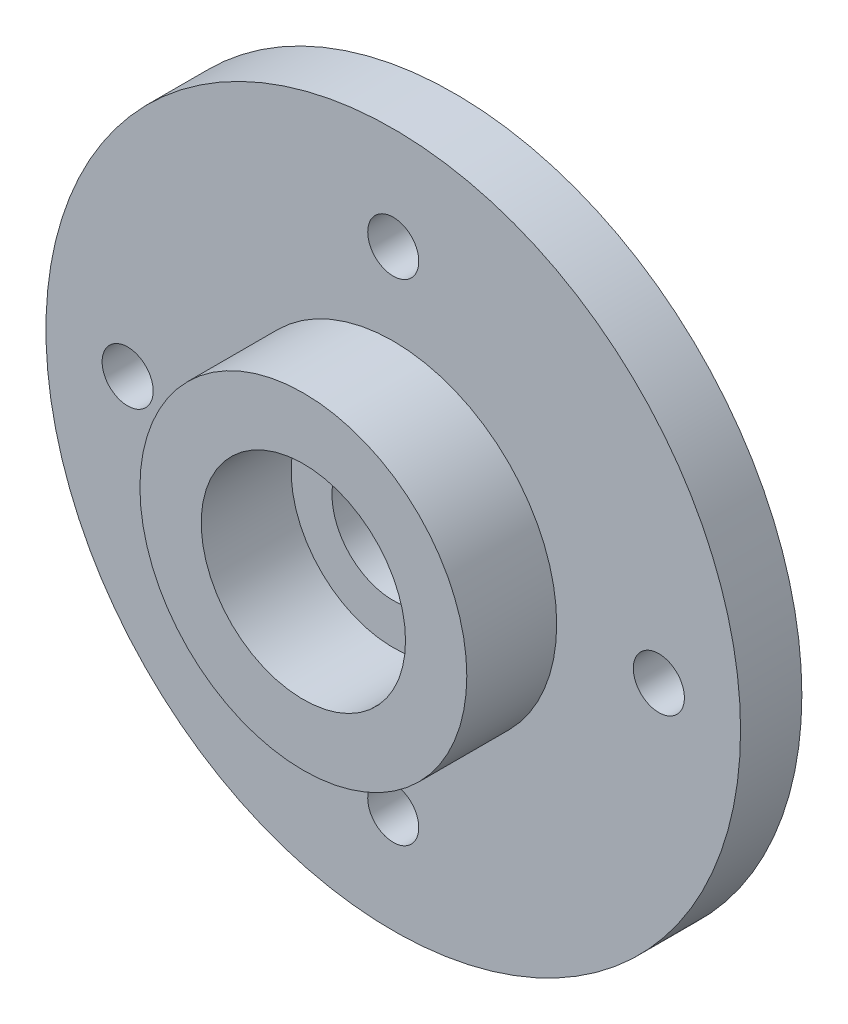
ISO-10303-21;
HEADER;
FILE_DESCRIPTION(('STEP AP214'),'2;1');
FILE_NAME('part.step','',(''),(''),'','','');
FILE_SCHEMA(('AUTOMOTIVE_DESIGN { 1 0 10303 214 1 1 1 1 }'));
ENDSEC;
DATA;
#1=APPLICATION_CONTEXT('core data for automotive mechanical design processes');
#2=APPLICATION_PROTOCOL_DEFINITION('international standard','automotive_design',2000,#1);
#3=PRODUCT_CONTEXT('',#1,'mechanical');
#4=PRODUCT('Part','Part','',(#3));
#5=PRODUCT_RELATED_PRODUCT_CATEGORY('part','',(#4));
#6=PRODUCT_DEFINITION_FORMATION('','',#4);
#7=PRODUCT_DEFINITION_CONTEXT('part definition',#1,'design');
#8=PRODUCT_DEFINITION('design','',#6,#7);
#9=PRODUCT_DEFINITION_SHAPE('','',#8);
#10=(LENGTH_UNIT() NAMED_UNIT(*) SI_UNIT(.MILLI.,.METRE.));
#11=(NAMED_UNIT(*) PLANE_ANGLE_UNIT() SI_UNIT($,.RADIAN.));
#12=(NAMED_UNIT(*) SI_UNIT($,.STERADIAN.) SOLID_ANGLE_UNIT());
#13=UNCERTAINTY_MEASURE_WITH_UNIT(LENGTH_MEASURE(1.E-05),#10,'distance_accuracy_value','');
#14=(GEOMETRIC_REPRESENTATION_CONTEXT(3) GLOBAL_UNCERTAINTY_ASSIGNED_CONTEXT((#13)) GLOBAL_UNIT_ASSIGNED_CONTEXT((#10,
#11,#12)) REPRESENTATION_CONTEXT('',''));
#15=CARTESIAN_POINT('',(0.,0.,0.));
#16=DIRECTION('',(0.,0.,1.));
#17=DIRECTION('',(1.,0.,0.));
#18=AXIS2_PLACEMENT_3D('',#15,#16,#17);
#19=CARTESIAN_POINT('',(0.,0.,0.));
#20=DIRECTION('',(0.,0.,1.));
#21=DIRECTION('',(1.,0.,0.));
#22=AXIS2_PLACEMENT_3D('',#19,#20,#21);
#23=PLANE('',#22);
#24=CARTESIAN_POINT('',(0.,0.,0.));
#25=DIRECTION('',(0.,0.,1.));
#26=DIRECTION('',(1.,0.,0.));
#27=AXIS2_PLACEMENT_3D('',#24,#25,#26);
#28=CIRCLE('',#27,1.5);
#29=CARTESIAN_POINT('',(1.5,0.,0.));
#30=VERTEX_POINT('',#29);
#31=EDGE_CURVE('E61',#30,#30,#28,.T.);
#32=ORIENTED_EDGE('',*,*,#31,.T.);
#33=EDGE_LOOP('',(#32));
#34=FACE_BOUND('',#33,.T.);
#35=CARTESIAN_POINT('',(0.,0.,0.));
#36=DIRECTION('',(0.,0.,-1.));
#37=DIRECTION('',(-1.,0.,0.));
#38=AXIS2_PLACEMENT_3D('',#35,#36,#37);
#39=CIRCLE('',#38,3.);
#40=CARTESIAN_POINT('',(-3.,0.,0.));
#41=VERTEX_POINT('',#40);
#42=EDGE_CURVE('E98',#41,#41,#39,.T.);
#43=ORIENTED_EDGE('',*,*,#42,.T.);
#44=EDGE_LOOP('',(#43));
#45=FACE_BOUND('',#44,.T.);
#46=ADVANCED_FACE('F32',(#34,#45),#23,.F.);
#47=CARTESIAN_POINT('',(0.,0.,1.5));
#48=DIRECTION('',(0.,0.,-1.));
#49=DIRECTION('',(-1.,0.,0.));
#50=AXIS2_PLACEMENT_3D('',#47,#48,#49);
#51=CYLINDRICAL_SURFACE('',#50,8.5);
#52=CARTESIAN_POINT('',(0.,0.,1.5));
#53=DIRECTION('',(0.,0.,1.));
#54=DIRECTION('',(1.,0.,0.));
#55=AXIS2_PLACEMENT_3D('',#52,#53,#54);
#56=CIRCLE('',#55,8.5);
#57=CARTESIAN_POINT('',(8.5,0.,1.5));
#58=VERTEX_POINT('',#57);
#59=EDGE_CURVE('E43',#58,#58,#56,.T.);
#60=ORIENTED_EDGE('',*,*,#59,.F.);
#61=EDGE_LOOP('',(#60));
#62=FACE_BOUND('',#61,.T.);
#63=CARTESIAN_POINT('',(0.,0.,0.));
#64=DIRECTION('',(0.,0.,1.));
#65=DIRECTION('',(1.,0.,0.));
#66=AXIS2_PLACEMENT_3D('',#63,#64,#65);
#67=CIRCLE('',#66,8.5);
#68=CARTESIAN_POINT('',(8.5,0.,0.));
#69=VERTEX_POINT('',#68);
#70=EDGE_CURVE('E48',#69,#69,#67,.T.);
#71=ORIENTED_EDGE('',*,*,#70,.T.);
#72=EDGE_LOOP('',(#71));
#73=FACE_BOUND('',#72,.T.);
#74=ADVANCED_FACE('F34',(#62,#73),#51,.T.);
#75=CARTESIAN_POINT('',(0.,0.,1.5));
#76=DIRECTION('',(0.,0.,1.));
#77=DIRECTION('',(1.,0.,0.));
#78=AXIS2_PLACEMENT_3D('',#75,#76,#77);
#79=PLANE('',#78);
#80=CARTESIAN_POINT('',(0.,-6.,1.5));
#81=DIRECTION('',(0.,0.,-1.));
#82=DIRECTION('',(-1.,0.,0.));
#83=AXIS2_PLACEMENT_3D('',#80,#81,#82);
#84=CIRCLE('',#83,0.625);
#85=CARTESIAN_POINT('',(-0.625,-6.,1.5));
#86=VERTEX_POINT('',#85);
#87=EDGE_CURVE('E86',#86,#86,#84,.T.);
#88=ORIENTED_EDGE('',*,*,#87,.T.);
#89=EDGE_LOOP('',(#88));
#90=FACE_BOUND('',#89,.T.);
#91=CARTESIAN_POINT('',(0.,6.,1.5));
#92=DIRECTION('',(0.,0.,-1.));
#93=DIRECTION('',(-1.,0.,0.));
#94=AXIS2_PLACEMENT_3D('',#91,#92,#93);
#95=CIRCLE('',#94,0.625);
#96=CARTESIAN_POINT('',(-0.625,6.,1.5));
#97=VERTEX_POINT('',#96);
#98=EDGE_CURVE('E82',#97,#97,#95,.T.);
#99=ORIENTED_EDGE('',*,*,#98,.T.);
#100=EDGE_LOOP('',(#99));
#101=FACE_BOUND('',#100,.T.);
#102=CARTESIAN_POINT('',(-6.5,0.,1.5));
#103=DIRECTION('',(0.,0.,1.));
#104=DIRECTION('',(1.,0.,0.));
#105=AXIS2_PLACEMENT_3D('',#102,#103,#104);
#106=CIRCLE('',#105,0.625);
#107=CARTESIAN_POINT('',(-5.875,0.,1.5));
#108=VERTEX_POINT('',#107);
#109=EDGE_CURVE('E76',#108,#108,#106,.F.);
#110=ORIENTED_EDGE('',*,*,#109,.T.);
#111=EDGE_LOOP('',(#110));
#112=FACE_BOUND('',#111,.T.);
#113=CARTESIAN_POINT('',(6.5,0.,1.5));
#114=DIRECTION('',(0.,0.,1.));
#115=DIRECTION('',(1.,0.,0.));
#116=AXIS2_PLACEMENT_3D('',#113,#114,#115);
#117=CIRCLE('',#116,0.625);
#118=CARTESIAN_POINT('',(7.125,0.,1.5));
#119=VERTEX_POINT('',#118);
#120=EDGE_CURVE('E66',#119,#119,#117,.F.);
#121=ORIENTED_EDGE('',*,*,#120,.T.);
#122=EDGE_LOOP('',(#121));
#123=FACE_BOUND('',#122,.T.);
#124=CARTESIAN_POINT('',(0.,0.,1.5));
#125=DIRECTION('',(0.,0.,1.));
#126=DIRECTION('',(1.,0.,0.));
#127=AXIS2_PLACEMENT_3D('',#124,#125,#126);
#128=CIRCLE('',#127,4.);
#129=CARTESIAN_POINT('',(4.,0.,1.5));
#130=VERTEX_POINT('',#129);
#131=EDGE_CURVE('E54',#130,#130,#128,.F.);
#132=ORIENTED_EDGE('',*,*,#131,.T.);
#133=EDGE_LOOP('',(#132));
#134=FACE_BOUND('',#133,.T.);
#135=ORIENTED_EDGE('',*,*,#59,.T.);
#136=EDGE_LOOP('',(#135));
#137=FACE_BOUND('',#136,.T.);
#138=ADVANCED_FACE('F128',(#90,#101,#112,#123,#134,#137),#79,.T.);
#139=CARTESIAN_POINT('',(0.,0.,0.));
#140=DIRECTION('',(0.,0.,1.));
#141=DIRECTION('',(1.,0.,0.));
#142=AXIS2_PLACEMENT_3D('',#139,#140,#141);
#143=CIRCLE('',#142,3.5);
#144=CARTESIAN_POINT('',(3.5,0.,0.));
#145=VERTEX_POINT('',#144);
#146=EDGE_CURVE('E10',#145,#145,#143,.F.);
#147=ORIENTED_EDGE('',*,*,#146,.F.);
#148=EDGE_LOOP('',(#147));
#149=FACE_BOUND('',#148,.T.);
#150=CARTESIAN_POINT('',(0.,-6.,0.));
#151=DIRECTION('',(0.,0.,-1.));
#152=DIRECTION('',(-1.,0.,0.));
#153=AXIS2_PLACEMENT_3D('',#150,#151,#152);
#154=CIRCLE('',#153,0.625);
#155=CARTESIAN_POINT('',(-0.625,-6.,0.));
#156=VERTEX_POINT('',#155);
#157=EDGE_CURVE('E89',#156,#156,#154,.T.);
#158=ORIENTED_EDGE('',*,*,#157,.F.);
#159=EDGE_LOOP('',(#158));
#160=FACE_BOUND('',#159,.T.);
#161=CARTESIAN_POINT('',(0.,6.,0.));
#162=DIRECTION('',(0.,0.,-1.));
#163=DIRECTION('',(-1.,0.,0.));
#164=AXIS2_PLACEMENT_3D('',#161,#162,#163);
#165=CIRCLE('',#164,0.625);
#166=CARTESIAN_POINT('',(-0.625,6.,0.));
#167=VERTEX_POINT('',#166);
#168=EDGE_CURVE('E83',#167,#167,#165,.T.);
#169=ORIENTED_EDGE('',*,*,#168,.F.);
#170=EDGE_LOOP('',(#169));
#171=FACE_BOUND('',#170,.T.);
#172=CARTESIAN_POINT('',(-6.5,0.,0.));
#173=DIRECTION('',(0.,0.,1.));
#174=DIRECTION('',(-1.,0.,0.));
#175=AXIS2_PLACEMENT_3D('',#172,#173,#174);
#176=CIRCLE('',#175,0.625);
#177=CARTESIAN_POINT('',(-7.125,0.,0.));
#178=VERTEX_POINT('',#177);
#179=EDGE_CURVE('E79',#178,#178,#176,.T.);
#180=ORIENTED_EDGE('',*,*,#179,.T.);
#181=EDGE_LOOP('',(#180));
#182=FACE_BOUND('',#181,.T.);
#183=CARTESIAN_POINT('',(6.5,0.,0.));
#184=DIRECTION('',(0.,0.,1.));
#185=DIRECTION('',(1.,0.,0.));
#186=AXIS2_PLACEMENT_3D('',#183,#184,#185);
#187=CIRCLE('',#186,0.625);
#188=CARTESIAN_POINT('',(7.125,0.,0.));
#189=VERTEX_POINT('',#188);
#190=EDGE_CURVE('E71',#189,#189,#187,.T.);
#191=ORIENTED_EDGE('',*,*,#190,.T.);
#192=EDGE_LOOP('',(#191));
#193=FACE_BOUND('',#192,.T.);
#194=ORIENTED_EDGE('',*,*,#70,.F.);
#195=EDGE_LOOP('',(#194));
#196=FACE_BOUND('',#195,.T.);
#197=ADVANCED_FACE('F124',(#149,#160,#171,#182,#193,#196),#23,.F.);
#198=CARTESIAN_POINT('',(0.,0.,3.7));
#199=DIRECTION('',(0.,0.,1.));
#200=DIRECTION('',(1.,0.,0.));
#201=AXIS2_PLACEMENT_3D('',#198,#199,#200);
#202=PLANE('',#201);
#203=CARTESIAN_POINT('',(0.,0.,3.7));
#204=DIRECTION('',(0.,0.,1.));
#205=DIRECTION('',(1.,0.,0.));
#206=AXIS2_PLACEMENT_3D('',#203,#204,#205);
#207=CIRCLE('',#206,4.);
#208=CARTESIAN_POINT('',(4.,0.,3.7));
#209=VERTEX_POINT('',#208);
#210=EDGE_CURVE('E52',#209,#209,#207,.T.);
#211=ORIENTED_EDGE('',*,*,#210,.T.);
#212=EDGE_LOOP('',(#211));
#213=FACE_BOUND('',#212,.T.);
#214=CARTESIAN_POINT('',(0.,0.,3.7));
#215=DIRECTION('',(0.,0.,1.));
#216=DIRECTION('',(1.,0.,0.));
#217=AXIS2_PLACEMENT_3D('',#214,#215,#216);
#218=CIRCLE('',#217,2.5);
#219=CARTESIAN_POINT('',(2.5,0.,3.7));
#220=VERTEX_POINT('',#219);
#221=EDGE_CURVE('E60',#220,#220,#218,.T.);
#222=ORIENTED_EDGE('',*,*,#221,.F.);
#223=EDGE_LOOP('',(#222));
#224=FACE_BOUND('',#223,.T.);
#225=ADVANCED_FACE('F133',(#213,#224),#202,.T.);
#226=CARTESIAN_POINT('',(0.,0.,3.7));
#227=DIRECTION('',(0.,0.,-1.));
#228=DIRECTION('',(-1.,0.,0.));
#229=AXIS2_PLACEMENT_3D('',#226,#227,#228);
#230=CYLINDRICAL_SURFACE('',#229,4.);
#231=ORIENTED_EDGE('',*,*,#131,.F.);
#232=EDGE_LOOP('',(#231));
#233=FACE_BOUND('',#232,.T.);
#234=ORIENTED_EDGE('',*,*,#210,.F.);
#235=EDGE_LOOP('',(#234));
#236=FACE_BOUND('',#235,.T.);
#237=ADVANCED_FACE('F139',(#233,#236),#230,.T.);
#238=CARTESIAN_POINT('',(0.,0.,3.7));
#239=DIRECTION('',(0.,0.,-1.));
#240=DIRECTION('',(-1.,0.,0.));
#241=AXIS2_PLACEMENT_3D('',#238,#239,#240);
#242=CYLINDRICAL_SURFACE('',#241,2.5);
#243=CARTESIAN_POINT('',(0.,0.,1.5));
#244=DIRECTION('',(0.,0.,1.));
#245=DIRECTION('',(1.,0.,0.));
#246=AXIS2_PLACEMENT_3D('',#243,#244,#245);
#247=CIRCLE('',#246,2.5);
#248=CARTESIAN_POINT('',(2.5,0.,1.5));
#249=VERTEX_POINT('',#248);
#250=EDGE_CURVE('E39',#249,#249,#247,.F.);
#251=ORIENTED_EDGE('',*,*,#250,.T.);
#252=EDGE_LOOP('',(#251));
#253=FACE_BOUND('',#252,.T.);
#254=ORIENTED_EDGE('',*,*,#221,.T.);
#255=EDGE_LOOP('',(#254));
#256=FACE_BOUND('',#255,.T.);
#257=ADVANCED_FACE('F173',(#253,#256),#242,.F.);
#258=CARTESIAN_POINT('',(0.,0.,1.5));
#259=DIRECTION('',(0.,0.,1.));
#260=DIRECTION('',(1.,0.,0.));
#261=AXIS2_PLACEMENT_3D('',#258,#259,#260);
#262=CIRCLE('',#261,1.5);
#263=CARTESIAN_POINT('',(1.5,0.,1.5));
#264=VERTEX_POINT('',#263);
#265=EDGE_CURVE('E58',#264,#264,#262,.F.);
#266=ORIENTED_EDGE('',*,*,#265,.T.);
#267=EDGE_LOOP('',(#266));
#268=FACE_BOUND('',#267,.T.);
#269=ORIENTED_EDGE('',*,*,#250,.F.);
#270=EDGE_LOOP('',(#269));
#271=FACE_BOUND('',#270,.T.);
#272=ADVANCED_FACE('F143',(#268,#271),#79,.T.);
#273=CARTESIAN_POINT('',(0.,0.,2.));
#274=DIRECTION('',(0.,0.,-1.));
#275=DIRECTION('',(-1.,0.,0.));
#276=AXIS2_PLACEMENT_3D('',#273,#274,#275);
#277=CYLINDRICAL_SURFACE('',#276,1.5);
#278=ORIENTED_EDGE('',*,*,#265,.F.);
#279=EDGE_LOOP('',(#278));
#280=FACE_BOUND('',#279,.T.);
#281=ORIENTED_EDGE('',*,*,#31,.F.);
#282=EDGE_LOOP('',(#281));
#283=FACE_BOUND('',#282,.T.);
#284=ADVANCED_FACE('F159',(#280,#283),#277,.F.);
#285=CARTESIAN_POINT('',(6.5,0.,2.));
#286=DIRECTION('',(0.,0.,-1.));
#287=DIRECTION('',(-1.,0.,0.));
#288=AXIS2_PLACEMENT_3D('',#285,#286,#287);
#289=CYLINDRICAL_SURFACE('',#288,0.625);
#290=ORIENTED_EDGE('',*,*,#120,.F.);
#291=EDGE_LOOP('',(#290));
#292=FACE_BOUND('',#291,.T.);
#293=ORIENTED_EDGE('',*,*,#190,.F.);
#294=EDGE_LOOP('',(#293));
#295=FACE_BOUND('',#294,.T.);
#296=ADVANCED_FACE('F156',(#292,#295),#289,.F.);
#297=CARTESIAN_POINT('',(-6.5,0.,2.));
#298=DIRECTION('',(0.,0.,-1.));
#299=DIRECTION('',(-1.,0.,0.));
#300=AXIS2_PLACEMENT_3D('',#297,#298,#299);
#301=CYLINDRICAL_SURFACE('',#300,0.625);
#302=ORIENTED_EDGE('',*,*,#109,.F.);
#303=EDGE_LOOP('',(#302));
#304=FACE_BOUND('',#303,.T.);
#305=ORIENTED_EDGE('',*,*,#179,.F.);
#306=EDGE_LOOP('',(#305));
#307=FACE_BOUND('',#306,.T.);
#308=ADVANCED_FACE('F158',(#304,#307),#301,.F.);
#309=CARTESIAN_POINT('',(0.,6.,1.5));
#310=DIRECTION('',(0.,0.,-1.));
#311=DIRECTION('',(-1.,0.,0.));
#312=AXIS2_PLACEMENT_3D('',#309,#310,#311);
#313=CYLINDRICAL_SURFACE('',#312,0.625);
#314=ORIENTED_EDGE('',*,*,#98,.F.);
#315=EDGE_LOOP('',(#314));
#316=FACE_BOUND('',#315,.T.);
#317=ORIENTED_EDGE('',*,*,#168,.T.);
#318=EDGE_LOOP('',(#317));
#319=FACE_BOUND('',#318,.T.);
#320=ADVANCED_FACE('F119',(#316,#319),#313,.F.);
#321=CARTESIAN_POINT('',(0.,-6.,1.5));
#322=DIRECTION('',(0.,0.,-1.));
#323=DIRECTION('',(-1.,0.,0.));
#324=AXIS2_PLACEMENT_3D('',#321,#322,#323);
#325=CYLINDRICAL_SURFACE('',#324,0.625);
#326=ORIENTED_EDGE('',*,*,#87,.F.);
#327=EDGE_LOOP('',(#326));
#328=FACE_BOUND('',#327,.T.);
#329=ORIENTED_EDGE('',*,*,#157,.T.);
#330=EDGE_LOOP('',(#329));
#331=FACE_BOUND('',#330,.T.);
#332=ADVANCED_FACE('F110',(#328,#331),#325,.F.);
#333=CARTESIAN_POINT('',(0.,0.,-1.));
#334=DIRECTION('',(0.,0.,-1.));
#335=DIRECTION('',(-1.,0.,0.));
#336=AXIS2_PLACEMENT_3D('',#333,#334,#335);
#337=PLANE('',#336);
#338=CARTESIAN_POINT('',(0.,0.,-1.));
#339=DIRECTION('',(0.,0.,-1.));
#340=DIRECTION('',(-1.,0.,0.));
#341=AXIS2_PLACEMENT_3D('',#338,#339,#340);
#342=CIRCLE('',#341,3.5);
#343=CARTESIAN_POINT('',(-3.5,0.,-1.));
#344=VERTEX_POINT('',#343);
#345=EDGE_CURVE('E92',#344,#344,#342,.T.);
#346=ORIENTED_EDGE('',*,*,#345,.T.);
#347=EDGE_LOOP('',(#346));
#348=FACE_BOUND('',#347,.T.);
#349=CARTESIAN_POINT('',(0.,0.,-1.));
#350=DIRECTION('',(0.,0.,-1.));
#351=DIRECTION('',(-1.,0.,0.));
#352=AXIS2_PLACEMENT_3D('',#349,#350,#351);
#353=CIRCLE('',#352,3.);
#354=CARTESIAN_POINT('',(-3.,0.,-1.));
#355=VERTEX_POINT('',#354);
#356=EDGE_CURVE('E97',#355,#355,#353,.T.);
#357=ORIENTED_EDGE('',*,*,#356,.F.);
#358=EDGE_LOOP('',(#357));
#359=FACE_BOUND('',#358,.T.);
#360=ADVANCED_FACE('F107',(#348,#359),#337,.T.);
#361=CARTESIAN_POINT('',(0.,0.,-1.));
#362=DIRECTION('',(0.,0.,1.));
#363=DIRECTION('',(1.,0.,0.));
#364=AXIS2_PLACEMENT_3D('',#361,#362,#363);
#365=CYLINDRICAL_SURFACE('',#364,3.5);
#366=ORIENTED_EDGE('',*,*,#345,.F.);
#367=EDGE_LOOP('',(#366));
#368=FACE_BOUND('',#367,.T.);
#369=ORIENTED_EDGE('',*,*,#146,.T.);
#370=EDGE_LOOP('',(#369));
#371=FACE_BOUND('',#370,.T.);
#372=ADVANCED_FACE('F109',(#368,#371),#365,.T.);
#373=CARTESIAN_POINT('',(0.,0.,-1.));
#374=DIRECTION('',(0.,0.,1.));
#375=DIRECTION('',(1.,0.,0.));
#376=AXIS2_PLACEMENT_3D('',#373,#374,#375);
#377=CYLINDRICAL_SURFACE('',#376,3.);
#378=ORIENTED_EDGE('',*,*,#356,.T.);
#379=EDGE_LOOP('',(#378));
#380=FACE_BOUND('',#379,.T.);
#381=ORIENTED_EDGE('',*,*,#42,.F.);
#382=EDGE_LOOP('',(#381));
#383=FACE_BOUND('',#382,.T.);
#384=ADVANCED_FACE('F104',(#380,#383),#377,.F.);
#385=CLOSED_SHELL('',(#46,#74,#138,#197,#225,#237,#257,#272,#284,#296,#308,#320,#332,#360,#372,#384));
#386=MANIFOLD_SOLID_BREP('B2',#385);
#387=ADVANCED_BREP_SHAPE_REPRESENTATION('',(#18,#386),#14);
#388=SHAPE_DEFINITION_REPRESENTATION(#9,#387);
ENDSEC;
END-ISO-10303-21;
